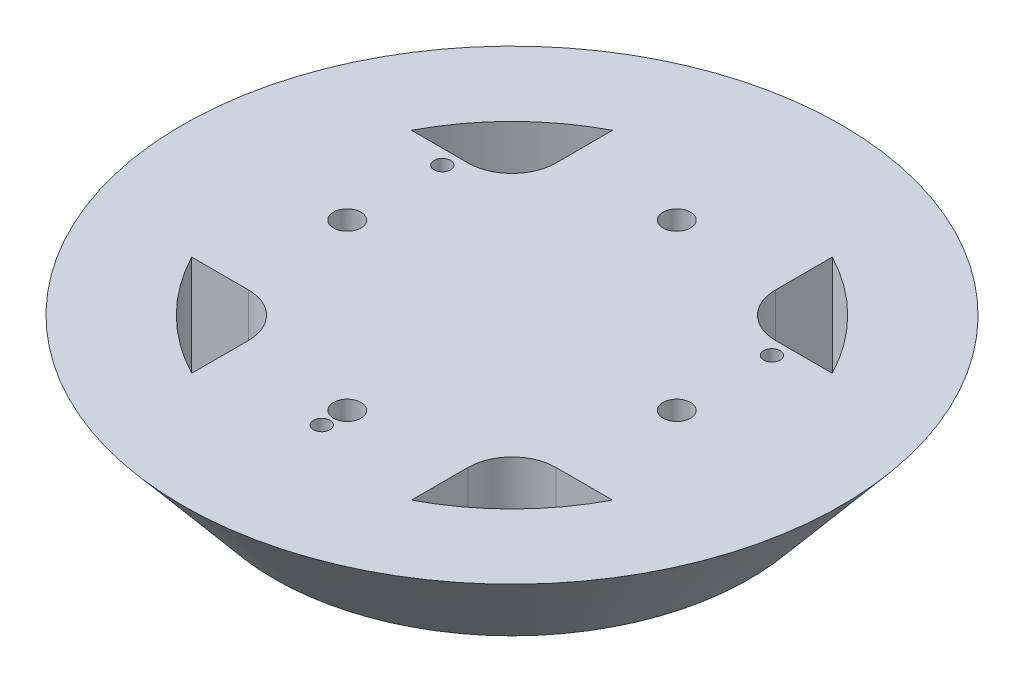
ISO-10303-21;
HEADER;
FILE_DESCRIPTION(('STEP AP214'),'2;1');
FILE_NAME('part.step','',(''),(''),'','','');
FILE_SCHEMA(('AUTOMOTIVE_DESIGN { 1 0 10303 214 1 1 1 1 }'));
ENDSEC;
DATA;
#1=APPLICATION_CONTEXT('core data for automotive mechanical design processes');
#2=APPLICATION_PROTOCOL_DEFINITION('international standard','automotive_design',2000,#1);
#3=PRODUCT_CONTEXT('',#1,'mechanical');
#4=PRODUCT('Part','Part','',(#3));
#5=PRODUCT_RELATED_PRODUCT_CATEGORY('part','',(#4));
#6=PRODUCT_DEFINITION_FORMATION('','',#4);
#7=PRODUCT_DEFINITION_CONTEXT('part definition',#1,'design');
#8=PRODUCT_DEFINITION('design','',#6,#7);
#9=PRODUCT_DEFINITION_SHAPE('','',#8);
#10=(LENGTH_UNIT() NAMED_UNIT(*) SI_UNIT(.MILLI.,.METRE.));
#11=(NAMED_UNIT(*) PLANE_ANGLE_UNIT() SI_UNIT($,.RADIAN.));
#12=(NAMED_UNIT(*) SI_UNIT($,.STERADIAN.) SOLID_ANGLE_UNIT());
#13=UNCERTAINTY_MEASURE_WITH_UNIT(LENGTH_MEASURE(1.E-05),#10,'distance_accuracy_value','');
#14=(GEOMETRIC_REPRESENTATION_CONTEXT(3) GLOBAL_UNCERTAINTY_ASSIGNED_CONTEXT((#13)) GLOBAL_UNIT_ASSIGNED_CONTEXT((#10,
#11,#12)) REPRESENTATION_CONTEXT('',''));
#15=CARTESIAN_POINT('',(0.,0.,0.));
#16=DIRECTION('',(0.,0.,1.));
#17=DIRECTION('',(1.,0.,0.));
#18=AXIS2_PLACEMENT_3D('',#15,#16,#17);
#19=CARTESIAN_POINT('',(0.,-20.,0.));
#20=DIRECTION('',(0.,1.,0.));
#21=DIRECTION('',(0.,0.,1.));
#22=AXIS2_PLACEMENT_3D('',#19,#20,#21);
#23=PLANE('',#22);
#24=CARTESIAN_POINT('',(29.9991199870944,-20.,-17.3199999999992));
#25=DIRECTION('',(0.,-1.,0.));
#26=DIRECTION('',(0.,0.,-1.));
#27=AXIS2_PLACEMENT_3D('',#24,#25,#26);
#28=CIRCLE('',#27,1.49999999999999);
#29=CARTESIAN_POINT('',(29.9991199870944,-20.,-18.8199999999992));
#30=VERTEX_POINT('',#29);
#31=EDGE_CURVE('E491',#30,#30,#28,.T.);
#32=ORIENTED_EDGE('',*,*,#31,.F.);
#33=EDGE_LOOP('',(#32));
#34=FACE_BOUND('',#33,.T.);
#35=CARTESIAN_POINT('',(-29.9991199870915,-20.,-17.3200000000008));
#36=DIRECTION('',(0.,-1.,0.));
#37=DIRECTION('',(0.,0.,-1.));
#38=AXIS2_PLACEMENT_3D('',#35,#36,#37);
#39=CIRCLE('',#38,1.49999999999999);
#40=CARTESIAN_POINT('',(-29.9991199870915,-20.,-18.8200000000008));
#41=VERTEX_POINT('',#40);
#42=EDGE_CURVE('E306',#41,#41,#39,.T.);
#43=ORIENTED_EDGE('',*,*,#42,.F.);
#44=EDGE_LOOP('',(#43));
#45=FACE_BOUND('',#44,.T.);
#46=DIRECTION('',(1.,0.,0.));
#47=VECTOR('',#46,1.);
#48=CARTESIAN_POINT('',(0.,-20.,-20.));
#49=LINE('',#48,#47);
#50=CARTESIAN_POINT('',(-38.3118279594078,-20.,-20.));
#51=VERTEX_POINT('',#50);
#52=CARTESIAN_POINT('',(-28.,-20.,-20.));
#53=VERTEX_POINT('',#52);
#54=EDGE_CURVE('E275',#51,#53,#49,.T.);
#55=ORIENTED_EDGE('',*,*,#54,.T.);
#56=CARTESIAN_POINT('',(-28.,-20.,-28.));
#57=DIRECTION('',(0.,1.,0.));
#58=DIRECTION('',(0.,0.,1.));
#59=AXIS2_PLACEMENT_3D('',#56,#57,#58);
#60=CIRCLE('',#59,8.);
#61=CARTESIAN_POINT('',(-20.,-20.,-28.));
#62=VERTEX_POINT('',#61);
#63=EDGE_CURVE('E251',#53,#62,#60,.T.);
#64=ORIENTED_EDGE('',*,*,#63,.T.);
#65=DIRECTION('',(0.,0.,1.));
#66=VECTOR('',#65,1.);
#67=CARTESIAN_POINT('',(-20.,-20.,0.));
#68=LINE('',#67,#66);
#69=CARTESIAN_POINT('',(-20.,-20.,-38.3118279594078));
#70=VERTEX_POINT('',#69);
#71=EDGE_CURVE('E272',#70,#62,#68,.T.);
#72=ORIENTED_EDGE('',*,*,#71,.F.);
#73=CARTESIAN_POINT('',(0.,-20.,0.));
#74=DIRECTION('',(0.,1.,0.));
#75=DIRECTION('',(0.,0.,1.));
#76=AXIS2_PLACEMENT_3D('',#73,#74,#75);
#77=CIRCLE('',#76,43.2180073764544);
#78=CARTESIAN_POINT('',(20.,-20.,-38.3118279594078));
#79=VERTEX_POINT('',#78);
#80=EDGE_CURVE('E194',#79,#70,#77,.T.);
#81=ORIENTED_EDGE('',*,*,#80,.F.);
#82=DIRECTION('',(0.,0.,1.));
#83=VECTOR('',#82,1.);
#84=CARTESIAN_POINT('',(20.,-20.,0.));
#85=LINE('',#84,#83);
#86=CARTESIAN_POINT('',(20.,-20.,-28.));
#87=VERTEX_POINT('',#86);
#88=EDGE_CURVE('E165',#79,#87,#85,.T.);
#89=ORIENTED_EDGE('',*,*,#88,.T.);
#90=CARTESIAN_POINT('',(28.,-20.,-28.));
#91=DIRECTION('',(0.,1.,0.));
#92=DIRECTION('',(0.,0.,1.));
#93=AXIS2_PLACEMENT_3D('',#90,#91,#92);
#94=CIRCLE('',#93,8.);
#95=CARTESIAN_POINT('',(28.,-20.,-20.));
#96=VERTEX_POINT('',#95);
#97=EDGE_CURVE('E247',#87,#96,#94,.T.);
#98=ORIENTED_EDGE('',*,*,#97,.T.);
#99=DIRECTION('',(-1.,0.,0.));
#100=VECTOR('',#99,1.);
#101=CARTESIAN_POINT('',(0.,-20.,-20.));
#102=LINE('',#101,#100);
#103=CARTESIAN_POINT('',(38.3118279594078,-20.,-20.));
#104=VERTEX_POINT('',#103);
#105=EDGE_CURVE('E320',#104,#96,#102,.T.);
#106=ORIENTED_EDGE('',*,*,#105,.F.);
#107=CARTESIAN_POINT('',(38.3118279594078,-20.,20.));
#108=VERTEX_POINT('',#107);
#109=EDGE_CURVE('E177',#108,#104,#77,.T.);
#110=ORIENTED_EDGE('',*,*,#109,.F.);
#111=DIRECTION('',(-1.,0.,0.));
#112=VECTOR('',#111,1.);
#113=CARTESIAN_POINT('',(0.,-20.,20.));
#114=LINE('',#113,#112);
#115=CARTESIAN_POINT('',(28.,-20.,20.));
#116=VERTEX_POINT('',#115);
#117=EDGE_CURVE('E186',#108,#116,#114,.T.);
#118=ORIENTED_EDGE('',*,*,#117,.T.);
#119=CARTESIAN_POINT('',(28.,-20.,28.));
#120=DIRECTION('',(0.,1.,0.));
#121=DIRECTION('',(0.,0.,1.));
#122=AXIS2_PLACEMENT_3D('',#119,#120,#121);
#123=CIRCLE('',#122,8.);
#124=CARTESIAN_POINT('',(20.,-20.,28.));
#125=VERTEX_POINT('',#124);
#126=EDGE_CURVE('E185',#116,#125,#123,.T.);
#127=ORIENTED_EDGE('',*,*,#126,.T.);
#128=DIRECTION('',(0.,0.,-1.));
#129=VECTOR('',#128,1.);
#130=CARTESIAN_POINT('',(20.,-20.,0.));
#131=LINE('',#130,#129);
#132=CARTESIAN_POINT('',(20.,-20.,38.3118279594078));
#133=VERTEX_POINT('',#132);
#134=EDGE_CURVE('E157',#133,#125,#131,.T.);
#135=ORIENTED_EDGE('',*,*,#134,.F.);
#136=CARTESIAN_POINT('',(-20.,-20.,38.3118279594078));
#137=VERTEX_POINT('',#136);
#138=EDGE_CURVE('E179',#137,#133,#77,.T.);
#139=ORIENTED_EDGE('',*,*,#138,.F.);
#140=DIRECTION('',(0.,0.,-1.));
#141=VECTOR('',#140,1.);
#142=CARTESIAN_POINT('',(-20.,-20.,0.));
#143=LINE('',#142,#141);
#144=CARTESIAN_POINT('',(-20.,-20.,28.));
#145=VERTEX_POINT('',#144);
#146=EDGE_CURVE('E292',#137,#145,#143,.T.);
#147=ORIENTED_EDGE('',*,*,#146,.T.);
#148=CARTESIAN_POINT('',(-28.,-20.,28.));
#149=DIRECTION('',(0.,1.,0.));
#150=DIRECTION('',(0.,0.,1.));
#151=AXIS2_PLACEMENT_3D('',#148,#149,#150);
#152=CIRCLE('',#151,8.);
#153=CARTESIAN_POINT('',(-28.,-20.,20.));
#154=VERTEX_POINT('',#153);
#155=EDGE_CURVE('E49',#145,#154,#152,.T.);
#156=ORIENTED_EDGE('',*,*,#155,.T.);
#157=DIRECTION('',(1.,0.,0.));
#158=VECTOR('',#157,1.);
#159=CARTESIAN_POINT('',(0.,-20.,20.));
#160=LINE('',#159,#158);
#161=CARTESIAN_POINT('',(-38.3118279594078,-20.,20.));
#162=VERTEX_POINT('',#161);
#163=EDGE_CURVE('E290',#162,#154,#160,.T.);
#164=ORIENTED_EDGE('',*,*,#163,.F.);
#165=EDGE_CURVE('E192',#51,#162,#77,.T.);
#166=ORIENTED_EDGE('',*,*,#165,.F.);
#167=EDGE_LOOP('',(#55,#64,#72,#81,#89,#98,#106,#110,#118,#127,#135,#139,#147,#156,#164,#166));
#168=FACE_BOUND('',#167,.T.);
#169=CARTESIAN_POINT('',(0.,-20.,34.64));
#170=DIRECTION('',(0.,-1.,0.));
#171=DIRECTION('',(0.,0.,-1.));
#172=AXIS2_PLACEMENT_3D('',#169,#170,#171);
#173=CIRCLE('',#172,1.49999999999999);
#174=CARTESIAN_POINT('',(0.,-20.,33.14));
#175=VERTEX_POINT('',#174);
#176=EDGE_CURVE('E462',#175,#175,#173,.T.);
#177=ORIENTED_EDGE('',*,*,#176,.F.);
#178=EDGE_LOOP('',(#177));
#179=FACE_BOUND('',#178,.T.);
#180=ADVANCED_FACE('F41',(#34,#45,#168,#179),#23,.F.);
#181=CARTESIAN_POINT('',(0.,0.,0.));
#182=DIRECTION('',(0.,1.,0.));
#183=DIRECTION('',(0.,0.,1.));
#184=AXIS2_PLACEMENT_3D('',#181,#182,#183);
#185=PLANE('',#184);
#186=CARTESIAN_POINT('',(0.,0.,-30.));
#187=DIRECTION('',(0.,1.,0.));
#188=DIRECTION('',(0.,0.,1.));
#189=AXIS2_PLACEMENT_3D('',#186,#187,#188);
#190=CIRCLE('',#189,2.5);
#191=CARTESIAN_POINT('',(0.,0.,-27.5));
#192=VERTEX_POINT('',#191);
#193=EDGE_CURVE('E463',#192,#192,#190,.T.);
#194=ORIENTED_EDGE('',*,*,#193,.F.);
#195=EDGE_LOOP('',(#194));
#196=FACE_BOUND('',#195,.T.);
#197=CARTESIAN_POINT('',(30.0000000000008,0.,-8.48279779752659E-13));
#198=DIRECTION('',(0.,1.,0.));
#199=DIRECTION('',(0.,0.,1.));
#200=AXIS2_PLACEMENT_3D('',#197,#198,#199);
#201=CIRCLE('',#200,2.5);
#202=CARTESIAN_POINT('',(30.0000000000008,0.,2.49999999999915));
#203=VERTEX_POINT('',#202);
#204=EDGE_CURVE('E469',#203,#203,#201,.T.);
#205=ORIENTED_EDGE('',*,*,#204,.F.);
#206=EDGE_LOOP('',(#205));
#207=FACE_BOUND('',#206,.T.);
#208=CARTESIAN_POINT('',(0.,0.,30.));
#209=DIRECTION('',(0.,1.,0.));
#210=DIRECTION('',(0.,0.,1.));
#211=AXIS2_PLACEMENT_3D('',#208,#209,#210);
#212=CIRCLE('',#211,2.5);
#213=CARTESIAN_POINT('',(0.,0.,32.5));
#214=VERTEX_POINT('',#213);
#215=EDGE_CURVE('E477',#214,#214,#212,.T.);
#216=ORIENTED_EDGE('',*,*,#215,.F.);
#217=EDGE_LOOP('',(#216));
#218=FACE_BOUND('',#217,.T.);
#219=CARTESIAN_POINT('',(-29.9999999999991,0.,8.50014503228635E-13));
#220=DIRECTION('',(0.,1.,0.));
#221=DIRECTION('',(0.,0.,1.));
#222=AXIS2_PLACEMENT_3D('',#219,#220,#221);
#223=CIRCLE('',#222,2.5);
#224=CARTESIAN_POINT('',(-29.9999999999991,0.,2.50000000000085));
#225=VERTEX_POINT('',#224);
#226=EDGE_CURVE('E483',#225,#225,#223,.T.);
#227=ORIENTED_EDGE('',*,*,#226,.F.);
#228=EDGE_LOOP('',(#227));
#229=FACE_BOUND('',#228,.T.);
#230=CARTESIAN_POINT('',(0.,0.,34.64));
#231=DIRECTION('',(0.,1.,0.));
#232=DIRECTION('',(0.,0.,1.));
#233=AXIS2_PLACEMENT_3D('',#230,#231,#232);
#234=CIRCLE('',#233,1.49999999999999);
#235=CARTESIAN_POINT('',(0.,0.,36.14));
#236=VERTEX_POINT('',#235);
#237=EDGE_CURVE('E466',#236,#236,#234,.T.);
#238=ORIENTED_EDGE('',*,*,#237,.F.);
#239=EDGE_LOOP('',(#238));
#240=FACE_BOUND('',#239,.T.);
#241=CARTESIAN_POINT('',(29.9991199870944,0.,-17.3199999999992));
#242=DIRECTION('',(0.,1.,0.));
#243=DIRECTION('',(0.,0.,1.));
#244=AXIS2_PLACEMENT_3D('',#241,#242,#243);
#245=CIRCLE('',#244,1.49999999999999);
#246=CARTESIAN_POINT('',(29.9991199870944,0.,-15.8199999999992));
#247=VERTEX_POINT('',#246);
#248=EDGE_CURVE('E311',#247,#247,#245,.T.);
#249=ORIENTED_EDGE('',*,*,#248,.F.);
#250=EDGE_LOOP('',(#249));
#251=FACE_BOUND('',#250,.T.);
#252=CARTESIAN_POINT('',(-29.9991199870915,0.,-17.3200000000008));
#253=DIRECTION('',(0.,1.,0.));
#254=DIRECTION('',(0.,0.,1.));
#255=AXIS2_PLACEMENT_3D('',#252,#253,#254);
#256=CIRCLE('',#255,1.49999999999999);
#257=CARTESIAN_POINT('',(-29.9991199870915,0.,-15.8200000000008));
#258=VERTEX_POINT('',#257);
#259=EDGE_CURVE('E304',#258,#258,#256,.T.);
#260=ORIENTED_EDGE('',*,*,#259,.F.);
#261=EDGE_LOOP('',(#260));
#262=FACE_BOUND('',#261,.T.);
#263=CARTESIAN_POINT('',(0.,0.,0.));
#264=DIRECTION('',(0.,1.,0.));
#265=DIRECTION('',(0.,0.,1.));
#266=AXIS2_PLACEMENT_3D('',#263,#264,#265);
#267=CIRCLE('',#266,43.2180073764544);
#268=CARTESIAN_POINT('',(-38.3118279594078,0.,20.));
#269=VERTEX_POINT('',#268);
#270=CARTESIAN_POINT('',(-20.,0.,38.3118279594078));
#271=VERTEX_POINT('',#270);
#272=EDGE_CURVE('E203',#269,#271,#267,.T.);
#273=ORIENTED_EDGE('',*,*,#272,.F.);
#274=DIRECTION('',(-1.,0.,0.));
#275=VECTOR('',#274,1.);
#276=CARTESIAN_POINT('',(0.,0.,20.));
#277=LINE('',#276,#275);
#278=CARTESIAN_POINT('',(-28.,0.,20.));
#279=VERTEX_POINT('',#278);
#280=EDGE_CURVE('E176',#279,#269,#277,.T.);
#281=ORIENTED_EDGE('',*,*,#280,.F.);
#282=CARTESIAN_POINT('',(-28.,0.,28.));
#283=DIRECTION('',(0.,1.,0.));
#284=DIRECTION('',(0.,0.,1.));
#285=AXIS2_PLACEMENT_3D('',#282,#283,#284);
#286=CIRCLE('',#285,8.);
#287=CARTESIAN_POINT('',(-20.,0.,28.));
#288=VERTEX_POINT('',#287);
#289=EDGE_CURVE('E12',#279,#288,#286,.F.);
#290=ORIENTED_EDGE('',*,*,#289,.T.);
#291=DIRECTION('',(0.,0.,1.));
#292=VECTOR('',#291,1.);
#293=CARTESIAN_POINT('',(-20.,0.,0.));
#294=LINE('',#293,#292);
#295=EDGE_CURVE('E201',#288,#271,#294,.T.);
#296=ORIENTED_EDGE('',*,*,#295,.T.);
#297=EDGE_LOOP('',(#273,#281,#290,#296));
#298=FACE_BOUND('',#297,.T.);
#299=CARTESIAN_POINT('',(0.,0.,0.));
#300=DIRECTION('',(0.,1.,0.));
#301=DIRECTION('',(0.,0.,1.));
#302=AXIS2_PLACEMENT_3D('',#299,#300,#301);
#303=CIRCLE('',#302,60.);
#304=CARTESIAN_POINT('',(0.,0.,60.));
#305=VERTEX_POINT('',#304);
#306=EDGE_CURVE('E193',#305,#305,#303,.T.);
#307=ORIENTED_EDGE('',*,*,#306,.T.);
#308=EDGE_LOOP('',(#307));
#309=FACE_BOUND('',#308,.T.);
#310=DIRECTION('',(0.,0.,1.));
#311=VECTOR('',#310,1.);
#312=CARTESIAN_POINT('',(20.,0.,0.));
#313=LINE('',#312,#311);
#314=CARTESIAN_POINT('',(20.,0.,28.));
#315=VERTEX_POINT('',#314);
#316=CARTESIAN_POINT('',(20.,0.,38.3118279594078));
#317=VERTEX_POINT('',#316);
#318=EDGE_CURVE('E160',#315,#317,#313,.T.);
#319=ORIENTED_EDGE('',*,*,#318,.F.);
#320=CARTESIAN_POINT('',(28.,0.,28.));
#321=DIRECTION('',(0.,1.,0.));
#322=DIRECTION('',(0.,0.,1.));
#323=AXIS2_PLACEMENT_3D('',#320,#321,#322);
#324=CIRCLE('',#323,8.);
#325=CARTESIAN_POINT('',(28.,0.,20.));
#326=VERTEX_POINT('',#325);
#327=EDGE_CURVE('E245',#315,#326,#324,.F.);
#328=ORIENTED_EDGE('',*,*,#327,.T.);
#329=DIRECTION('',(1.,0.,0.));
#330=VECTOR('',#329,1.);
#331=CARTESIAN_POINT('',(0.,0.,20.));
#332=LINE('',#331,#330);
#333=CARTESIAN_POINT('',(38.3118279594078,0.,20.));
#334=VERTEX_POINT('',#333);
#335=EDGE_CURVE('E209',#326,#334,#332,.T.);
#336=ORIENTED_EDGE('',*,*,#335,.T.);
#337=CARTESIAN_POINT('',(0.,0.,0.));
#338=DIRECTION('',(0.,1.,0.));
#339=DIRECTION('',(0.,0.,1.));
#340=AXIS2_PLACEMENT_3D('',#337,#338,#339);
#341=CIRCLE('',#340,43.2180073764544);
#342=EDGE_CURVE('E206',#317,#334,#341,.T.);
#343=ORIENTED_EDGE('',*,*,#342,.F.);
#344=EDGE_LOOP('',(#319,#328,#336,#343));
#345=FACE_BOUND('',#344,.T.);
#346=DIRECTION('',(1.,0.,0.));
#347=VECTOR('',#346,1.);
#348=CARTESIAN_POINT('',(0.,0.,-20.));
#349=LINE('',#348,#347);
#350=CARTESIAN_POINT('',(28.,0.,-20.));
#351=VERTEX_POINT('',#350);
#352=CARTESIAN_POINT('',(38.3118279594078,0.,-20.));
#353=VERTEX_POINT('',#352);
#354=EDGE_CURVE('E214',#351,#353,#349,.T.);
#355=ORIENTED_EDGE('',*,*,#354,.F.);
#356=CARTESIAN_POINT('',(28.,0.,-28.));
#357=DIRECTION('',(0.,1.,0.));
#358=DIRECTION('',(0.,0.,1.));
#359=AXIS2_PLACEMENT_3D('',#356,#357,#358);
#360=CIRCLE('',#359,8.);
#361=CARTESIAN_POINT('',(20.,0.,-28.));
#362=VERTEX_POINT('',#361);
#363=EDGE_CURVE('E249',#351,#362,#360,.F.);
#364=ORIENTED_EDGE('',*,*,#363,.T.);
#365=DIRECTION('',(0.,0.,-1.));
#366=VECTOR('',#365,1.);
#367=CARTESIAN_POINT('',(20.,0.,0.));
#368=LINE('',#367,#366);
#369=CARTESIAN_POINT('',(20.,0.,-38.3118279594078));
#370=VERTEX_POINT('',#369);
#371=EDGE_CURVE('E216',#362,#370,#368,.T.);
#372=ORIENTED_EDGE('',*,*,#371,.T.);
#373=CARTESIAN_POINT('',(0.,0.,0.));
#374=DIRECTION('',(0.,1.,0.));
#375=DIRECTION('',(0.,0.,1.));
#376=AXIS2_PLACEMENT_3D('',#373,#374,#375);
#377=CIRCLE('',#376,43.2180073764544);
#378=EDGE_CURVE('E211',#353,#370,#377,.T.);
#379=ORIENTED_EDGE('',*,*,#378,.F.);
#380=EDGE_LOOP('',(#355,#364,#372,#379));
#381=FACE_BOUND('',#380,.T.);
#382=DIRECTION('',(0.,0.,-1.));
#383=VECTOR('',#382,1.);
#384=CARTESIAN_POINT('',(-20.,0.,0.));
#385=LINE('',#384,#383);
#386=CARTESIAN_POINT('',(-20.,0.,-28.));
#387=VERTEX_POINT('',#386);
#388=CARTESIAN_POINT('',(-20.,0.,-38.3118279594078));
#389=VERTEX_POINT('',#388);
#390=EDGE_CURVE('E221',#387,#389,#385,.T.);
#391=ORIENTED_EDGE('',*,*,#390,.F.);
#392=CARTESIAN_POINT('',(-28.,0.,-28.));
#393=DIRECTION('',(0.,1.,0.));
#394=DIRECTION('',(0.,0.,1.));
#395=AXIS2_PLACEMENT_3D('',#392,#393,#394);
#396=CIRCLE('',#395,8.);
#397=CARTESIAN_POINT('',(-28.,0.,-20.));
#398=VERTEX_POINT('',#397);
#399=EDGE_CURVE('E253',#387,#398,#396,.F.);
#400=ORIENTED_EDGE('',*,*,#399,.T.);
#401=DIRECTION('',(-1.,0.,0.));
#402=VECTOR('',#401,1.);
#403=CARTESIAN_POINT('',(0.,0.,-20.));
#404=LINE('',#403,#402);
#405=CARTESIAN_POINT('',(-38.3118279594078,0.,-20.));
#406=VERTEX_POINT('',#405);
#407=EDGE_CURVE('E223',#398,#406,#404,.T.);
#408=ORIENTED_EDGE('',*,*,#407,.T.);
#409=CARTESIAN_POINT('',(0.,0.,0.));
#410=DIRECTION('',(0.,1.,0.));
#411=DIRECTION('',(0.,0.,1.));
#412=AXIS2_PLACEMENT_3D('',#409,#410,#411);
#413=CIRCLE('',#412,43.2180073764544);
#414=EDGE_CURVE('E218',#389,#406,#413,.T.);
#415=ORIENTED_EDGE('',*,*,#414,.F.);
#416=EDGE_LOOP('',(#391,#400,#408,#415));
#417=FACE_BOUND('',#416,.T.);
#418=ADVANCED_FACE('F258',(#196,#207,#218,#229,#240,#251,#262,#298,#309,#345,#381,#417),#185,.T.);
#419=CARTESIAN_POINT('',(0.,0.,0.));
#420=DIRECTION('',(0.,1.,0.));
#421=DIRECTION('',(0.,0.,1.));
#422=AXIS2_PLACEMENT_3D('',#419,#420,#421);
#423=CONICAL_SURFACE('',#422,60.,0.698131700797733);
#424=EDGE_CURVE('E169',#133,#108,#77,.T.);
#425=ORIENTED_EDGE('',*,*,#424,.T.);
#426=ORIENTED_EDGE('',*,*,#109,.T.);
#427=CARTESIAN_POINT('',(0.,-20.,0.));
#428=DIRECTION('',(0.,-1.,0.));
#429=DIRECTION('',(0.,0.,-1.));
#430=AXIS2_PLACEMENT_3D('',#427,#428,#429);
#431=CIRCLE('',#430,43.2180073764544);
#432=EDGE_CURVE('E324',#79,#104,#431,.T.);
#433=ORIENTED_EDGE('',*,*,#432,.F.);
#434=ORIENTED_EDGE('',*,*,#80,.T.);
#435=CARTESIAN_POINT('',(0.,-20.,0.));
#436=DIRECTION('',(0.,-1.,0.));
#437=DIRECTION('',(0.,0.,-1.));
#438=AXIS2_PLACEMENT_3D('',#435,#436,#437);
#439=CIRCLE('',#438,43.2180073764544);
#440=EDGE_CURVE('E281',#51,#70,#439,.T.);
#441=ORIENTED_EDGE('',*,*,#440,.F.);
#442=ORIENTED_EDGE('',*,*,#165,.T.);
#443=CARTESIAN_POINT('',(0.,-20.,0.));
#444=DIRECTION('',(0.,-1.,0.));
#445=DIRECTION('',(0.,0.,-1.));
#446=AXIS2_PLACEMENT_3D('',#443,#444,#445);
#447=CIRCLE('',#446,43.2180073764544);
#448=EDGE_CURVE('E191',#137,#162,#447,.T.);
#449=ORIENTED_EDGE('',*,*,#448,.F.);
#450=ORIENTED_EDGE('',*,*,#138,.T.);
#451=EDGE_LOOP('',(#425,#426,#433,#434,#441,#442,#449,#450));
#452=FACE_BOUND('',#451,.T.);
#453=ORIENTED_EDGE('',*,*,#306,.F.);
#454=EDGE_LOOP('',(#453));
#455=FACE_BOUND('',#454,.T.);
#456=ADVANCED_FACE('F188',(#452,#455),#423,.T.);
#457=CARTESIAN_POINT('',(0.,5.,0.));
#458=DIRECTION('',(0.,-1.,0.));
#459=DIRECTION('',(0.,0.,-1.));
#460=AXIS2_PLACEMENT_3D('',#457,#458,#459);
#461=CYLINDRICAL_SURFACE('',#460,43.2180073764544);
#462=ORIENTED_EDGE('',*,*,#272,.T.);
#463=DIRECTION('',(0.,-1.,0.));
#464=VECTOR('',#463,1.);
#465=CARTESIAN_POINT('',(-20.,5.,38.3118279594078));
#466=LINE('',#465,#464);
#467=EDGE_CURVE('E196',#271,#137,#466,.T.);
#468=ORIENTED_EDGE('',*,*,#467,.T.);
#469=ORIENTED_EDGE('',*,*,#448,.T.);
#470=DIRECTION('',(0.,-1.,0.));
#471=VECTOR('',#470,1.);
#472=CARTESIAN_POINT('',(-38.3118279594078,5.,20.));
#473=LINE('',#472,#471);
#474=EDGE_CURVE('E294',#269,#162,#473,.T.);
#475=ORIENTED_EDGE('',*,*,#474,.F.);
#476=EDGE_LOOP('',(#462,#468,#469,#475));
#477=FACE_BOUND('',#476,.T.);
#478=ADVANCED_FACE('F361',(#477),#461,.F.);
#479=CARTESIAN_POINT('',(-20.,5.,0.));
#480=DIRECTION('',(-1.,0.,0.));
#481=DIRECTION('',(0.,0.,1.));
#482=AXIS2_PLACEMENT_3D('',#479,#480,#481);
#483=PLANE('',#482);
#484=ORIENTED_EDGE('',*,*,#295,.F.);
#485=DIRECTION('',(0.,-1.,0.));
#486=VECTOR('',#485,1.);
#487=CARTESIAN_POINT('',(-20.,5.,28.));
#488=LINE('',#487,#486);
#489=EDGE_CURVE('E240',#288,#145,#488,.T.);
#490=ORIENTED_EDGE('',*,*,#489,.T.);
#491=ORIENTED_EDGE('',*,*,#146,.F.);
#492=ORIENTED_EDGE('',*,*,#467,.F.);
#493=EDGE_LOOP('',(#484,#490,#491,#492));
#494=FACE_BOUND('',#493,.T.);
#495=ADVANCED_FACE('F392',(#494),#483,.T.);
#496=CARTESIAN_POINT('',(0.,5.,20.));
#497=DIRECTION('',(0.,0.,-1.));
#498=DIRECTION('',(-1.,0.,0.));
#499=AXIS2_PLACEMENT_3D('',#496,#497,#498);
#500=PLANE('',#499);
#501=ORIENTED_EDGE('',*,*,#163,.T.);
#502=DIRECTION('',(0.,-1.,0.));
#503=VECTOR('',#502,1.);
#504=CARTESIAN_POINT('',(-28.,5.,20.));
#505=LINE('',#504,#503);
#506=EDGE_CURVE('E62',#154,#279,#505,.F.);
#507=ORIENTED_EDGE('',*,*,#506,.T.);
#508=ORIENTED_EDGE('',*,*,#280,.T.);
#509=ORIENTED_EDGE('',*,*,#474,.T.);
#510=EDGE_LOOP('',(#501,#507,#508,#509));
#511=FACE_BOUND('',#510,.T.);
#512=ADVANCED_FACE('F297',(#511),#500,.F.);
#513=CARTESIAN_POINT('',(0.,5.,20.));
#514=DIRECTION('',(0.,0.,1.));
#515=DIRECTION('',(1.,0.,0.));
#516=AXIS2_PLACEMENT_3D('',#513,#514,#515);
#517=PLANE('',#516);
#518=ORIENTED_EDGE('',*,*,#335,.F.);
#519=DIRECTION('',(0.,-1.,0.));
#520=VECTOR('',#519,1.);
#521=CARTESIAN_POINT('',(28.,5.,20.));
#522=LINE('',#521,#520);
#523=EDGE_CURVE('E225',#326,#116,#522,.T.);
#524=ORIENTED_EDGE('',*,*,#523,.T.);
#525=ORIENTED_EDGE('',*,*,#117,.F.);
#526=DIRECTION('',(0.,-1.,0.));
#527=VECTOR('',#526,1.);
#528=CARTESIAN_POINT('',(38.3118279594078,5.,20.));
#529=LINE('',#528,#527);
#530=EDGE_CURVE('E164',#334,#108,#529,.T.);
#531=ORIENTED_EDGE('',*,*,#530,.F.);
#532=EDGE_LOOP('',(#518,#524,#525,#531));
#533=FACE_BOUND('',#532,.T.);
#534=ADVANCED_FACE('F348',(#533),#517,.T.);
#535=CARTESIAN_POINT('',(20.,5.,0.));
#536=DIRECTION('',(-1.,0.,0.));
#537=DIRECTION('',(0.,0.,1.));
#538=AXIS2_PLACEMENT_3D('',#535,#536,#537);
#539=PLANE('',#538);
#540=ORIENTED_EDGE('',*,*,#134,.T.);
#541=DIRECTION('',(0.,-1.,0.));
#542=VECTOR('',#541,1.);
#543=CARTESIAN_POINT('',(20.,5.,28.));
#544=LINE('',#543,#542);
#545=EDGE_CURVE('E228',#125,#315,#544,.F.);
#546=ORIENTED_EDGE('',*,*,#545,.T.);
#547=ORIENTED_EDGE('',*,*,#318,.T.);
#548=DIRECTION('',(0.,-1.,0.));
#549=VECTOR('',#548,1.);
#550=CARTESIAN_POINT('',(20.,5.,38.3118279594078));
#551=LINE('',#550,#549);
#552=EDGE_CURVE('E153',#317,#133,#551,.T.);
#553=ORIENTED_EDGE('',*,*,#552,.T.);
#554=EDGE_LOOP('',(#540,#546,#547,#553));
#555=FACE_BOUND('',#554,.T.);
#556=ADVANCED_FACE('F155',(#555),#539,.F.);
#557=CARTESIAN_POINT('',(0.,5.,0.));
#558=DIRECTION('',(0.,-1.,0.));
#559=DIRECTION('',(0.,0.,-1.));
#560=AXIS2_PLACEMENT_3D('',#557,#558,#559);
#561=CYLINDRICAL_SURFACE('',#560,43.2180073764544);
#562=ORIENTED_EDGE('',*,*,#342,.T.);
#563=ORIENTED_EDGE('',*,*,#530,.T.);
#564=ORIENTED_EDGE('',*,*,#424,.F.);
#565=ORIENTED_EDGE('',*,*,#552,.F.);
#566=EDGE_LOOP('',(#562,#563,#564,#565));
#567=FACE_BOUND('',#566,.T.);
#568=ADVANCED_FACE('F170',(#567),#561,.F.);
#569=CARTESIAN_POINT('',(20.,5.,0.));
#570=DIRECTION('',(1.,0.,0.));
#571=DIRECTION('',(0.,0.,-1.));
#572=AXIS2_PLACEMENT_3D('',#569,#570,#571);
#573=PLANE('',#572);
#574=ORIENTED_EDGE('',*,*,#371,.F.);
#575=DIRECTION('',(0.,-1.,0.));
#576=VECTOR('',#575,1.);
#577=CARTESIAN_POINT('',(20.,5.,-28.));
#578=LINE('',#577,#576);
#579=EDGE_CURVE('E230',#362,#87,#578,.T.);
#580=ORIENTED_EDGE('',*,*,#579,.T.);
#581=ORIENTED_EDGE('',*,*,#88,.F.);
#582=DIRECTION('',(0.,-1.,0.));
#583=VECTOR('',#582,1.);
#584=CARTESIAN_POINT('',(20.,5.,-38.3118279594078));
#585=LINE('',#584,#583);
#586=EDGE_CURVE('E317',#370,#79,#585,.T.);
#587=ORIENTED_EDGE('',*,*,#586,.F.);
#588=EDGE_LOOP('',(#574,#580,#581,#587));
#589=FACE_BOUND('',#588,.T.);
#590=ADVANCED_FACE('F332',(#589),#573,.T.);
#591=CARTESIAN_POINT('',(0.,5.,-20.));
#592=DIRECTION('',(0.,0.,1.));
#593=DIRECTION('',(1.,0.,0.));
#594=AXIS2_PLACEMENT_3D('',#591,#592,#593);
#595=PLANE('',#594);
#596=ORIENTED_EDGE('',*,*,#105,.T.);
#597=DIRECTION('',(0.,-1.,0.));
#598=VECTOR('',#597,1.);
#599=CARTESIAN_POINT('',(28.,5.,-20.));
#600=LINE('',#599,#598);
#601=EDGE_CURVE('E233',#96,#351,#600,.F.);
#602=ORIENTED_EDGE('',*,*,#601,.T.);
#603=ORIENTED_EDGE('',*,*,#354,.T.);
#604=DIRECTION('',(0.,-1.,0.));
#605=VECTOR('',#604,1.);
#606=CARTESIAN_POINT('',(38.3118279594078,5.,-20.));
#607=LINE('',#606,#605);
#608=EDGE_CURVE('E288',#353,#104,#607,.T.);
#609=ORIENTED_EDGE('',*,*,#608,.T.);
#610=EDGE_LOOP('',(#596,#602,#603,#609));
#611=FACE_BOUND('',#610,.T.);
#612=ADVANCED_FACE('F345',(#611),#595,.F.);
#613=CARTESIAN_POINT('',(0.,5.,0.));
#614=DIRECTION('',(0.,-1.,0.));
#615=DIRECTION('',(0.,0.,-1.));
#616=AXIS2_PLACEMENT_3D('',#613,#614,#615);
#617=CYLINDRICAL_SURFACE('',#616,43.2180073764544);
#618=ORIENTED_EDGE('',*,*,#378,.T.);
#619=ORIENTED_EDGE('',*,*,#586,.T.);
#620=ORIENTED_EDGE('',*,*,#432,.T.);
#621=ORIENTED_EDGE('',*,*,#608,.F.);
#622=EDGE_LOOP('',(#618,#619,#620,#621));
#623=FACE_BOUND('',#622,.T.);
#624=ADVANCED_FACE('F335',(#623),#617,.F.);
#625=CARTESIAN_POINT('',(0.,5.,-20.));
#626=DIRECTION('',(0.,0.,-1.));
#627=DIRECTION('',(-1.,0.,0.));
#628=AXIS2_PLACEMENT_3D('',#625,#626,#627);
#629=PLANE('',#628);
#630=ORIENTED_EDGE('',*,*,#407,.F.);
#631=DIRECTION('',(0.,-1.,0.));
#632=VECTOR('',#631,1.);
#633=CARTESIAN_POINT('',(-28.,5.,-20.));
#634=LINE('',#633,#632);
#635=EDGE_CURVE('E235',#398,#53,#634,.T.);
#636=ORIENTED_EDGE('',*,*,#635,.T.);
#637=ORIENTED_EDGE('',*,*,#54,.F.);
#638=DIRECTION('',(0.,-1.,0.));
#639=VECTOR('',#638,1.);
#640=CARTESIAN_POINT('',(-38.3118279594078,5.,-20.));
#641=LINE('',#640,#639);
#642=EDGE_CURVE('E267',#406,#51,#641,.T.);
#643=ORIENTED_EDGE('',*,*,#642,.F.);
#644=EDGE_LOOP('',(#630,#636,#637,#643));
#645=FACE_BOUND('',#644,.T.);
#646=ADVANCED_FACE('F265',(#645),#629,.T.);
#647=CARTESIAN_POINT('',(-20.,5.,0.));
#648=DIRECTION('',(1.,0.,0.));
#649=DIRECTION('',(0.,0.,-1.));
#650=AXIS2_PLACEMENT_3D('',#647,#648,#649);
#651=PLANE('',#650);
#652=ORIENTED_EDGE('',*,*,#71,.T.);
#653=DIRECTION('',(0.,-1.,0.));
#654=VECTOR('',#653,1.);
#655=CARTESIAN_POINT('',(-20.,5.,-28.));
#656=LINE('',#655,#654);
#657=EDGE_CURVE('E238',#62,#387,#656,.F.);
#658=ORIENTED_EDGE('',*,*,#657,.T.);
#659=ORIENTED_EDGE('',*,*,#390,.T.);
#660=DIRECTION('',(0.,-1.,0.));
#661=VECTOR('',#660,1.);
#662=CARTESIAN_POINT('',(-20.,5.,-38.3118279594078));
#663=LINE('',#662,#661);
#664=EDGE_CURVE('E279',#389,#70,#663,.T.);
#665=ORIENTED_EDGE('',*,*,#664,.T.);
#666=EDGE_LOOP('',(#652,#658,#659,#665));
#667=FACE_BOUND('',#666,.T.);
#668=ADVANCED_FACE('F277',(#667),#651,.F.);
#669=CARTESIAN_POINT('',(0.,5.,0.));
#670=DIRECTION('',(0.,-1.,0.));
#671=DIRECTION('',(0.,0.,-1.));
#672=AXIS2_PLACEMENT_3D('',#669,#670,#671);
#673=CYLINDRICAL_SURFACE('',#672,43.2180073764544);
#674=ORIENTED_EDGE('',*,*,#414,.T.);
#675=ORIENTED_EDGE('',*,*,#642,.T.);
#676=ORIENTED_EDGE('',*,*,#440,.T.);
#677=ORIENTED_EDGE('',*,*,#664,.F.);
#678=EDGE_LOOP('',(#674,#675,#676,#677));
#679=FACE_BOUND('',#678,.T.);
#680=ADVANCED_FACE('F303',(#679),#673,.F.);
#681=CARTESIAN_POINT('',(-29.9991199870915,-20.,-17.3200000000008));
#682=DIRECTION('',(0.,-1.,0.));
#683=DIRECTION('',(0.,0.,-1.));
#684=AXIS2_PLACEMENT_3D('',#681,#682,#683);
#685=CYLINDRICAL_SURFACE('',#684,1.49999999999999);
#686=ORIENTED_EDGE('',*,*,#42,.T.);
#687=EDGE_LOOP('',(#686));
#688=FACE_BOUND('',#687,.T.);
#689=ORIENTED_EDGE('',*,*,#259,.T.);
#690=EDGE_LOOP('',(#689));
#691=FACE_BOUND('',#690,.T.);
#692=ADVANCED_FACE('F406',(#688,#691),#685,.F.);
#693=CARTESIAN_POINT('',(29.9991199870944,-20.,-17.3199999999992));
#694=DIRECTION('',(0.,-1.,0.));
#695=DIRECTION('',(0.,0.,-1.));
#696=AXIS2_PLACEMENT_3D('',#693,#694,#695);
#697=CYLINDRICAL_SURFACE('',#696,1.49999999999999);
#698=ORIENTED_EDGE('',*,*,#31,.T.);
#699=EDGE_LOOP('',(#698));
#700=FACE_BOUND('',#699,.T.);
#701=ORIENTED_EDGE('',*,*,#248,.T.);
#702=EDGE_LOOP('',(#701));
#703=FACE_BOUND('',#702,.T.);
#704=ADVANCED_FACE('F423',(#700,#703),#697,.F.);
#705=CARTESIAN_POINT('',(0.,-20.,34.64));
#706=DIRECTION('',(0.,-1.,0.));
#707=DIRECTION('',(0.,0.,-1.));
#708=AXIS2_PLACEMENT_3D('',#705,#706,#707);
#709=CYLINDRICAL_SURFACE('',#708,1.49999999999999);
#710=ORIENTED_EDGE('',*,*,#176,.T.);
#711=EDGE_LOOP('',(#710));
#712=FACE_BOUND('',#711,.T.);
#713=ORIENTED_EDGE('',*,*,#237,.T.);
#714=EDGE_LOOP('',(#713));
#715=FACE_BOUND('',#714,.T.);
#716=ADVANCED_FACE('F371',(#712,#715),#709,.F.);
#717=CARTESIAN_POINT('',(28.,5.,28.));
#718=DIRECTION('',(0.,-1.,0.));
#719=DIRECTION('',(0.,0.,-1.));
#720=AXIS2_PLACEMENT_3D('',#717,#718,#719);
#721=CYLINDRICAL_SURFACE('',#720,8.);
#722=ORIENTED_EDGE('',*,*,#327,.F.);
#723=ORIENTED_EDGE('',*,*,#545,.F.);
#724=ORIENTED_EDGE('',*,*,#126,.F.);
#725=ORIENTED_EDGE('',*,*,#523,.F.);
#726=EDGE_LOOP('',(#722,#723,#724,#725));
#727=FACE_BOUND('',#726,.T.);
#728=ADVANCED_FACE('F352',(#727),#721,.F.);
#729=CARTESIAN_POINT('',(28.,5.,-28.));
#730=DIRECTION('',(0.,-1.,0.));
#731=DIRECTION('',(0.,0.,-1.));
#732=AXIS2_PLACEMENT_3D('',#729,#730,#731);
#733=CYLINDRICAL_SURFACE('',#732,8.);
#734=ORIENTED_EDGE('',*,*,#363,.F.);
#735=ORIENTED_EDGE('',*,*,#601,.F.);
#736=ORIENTED_EDGE('',*,*,#97,.F.);
#737=ORIENTED_EDGE('',*,*,#579,.F.);
#738=EDGE_LOOP('',(#734,#735,#736,#737));
#739=FACE_BOUND('',#738,.T.);
#740=ADVANCED_FACE('F342',(#739),#733,.F.);
#741=CARTESIAN_POINT('',(-28.,5.,-28.));
#742=DIRECTION('',(0.,-1.,0.));
#743=DIRECTION('',(0.,0.,-1.));
#744=AXIS2_PLACEMENT_3D('',#741,#742,#743);
#745=CYLINDRICAL_SURFACE('',#744,8.);
#746=ORIENTED_EDGE('',*,*,#399,.F.);
#747=ORIENTED_EDGE('',*,*,#657,.F.);
#748=ORIENTED_EDGE('',*,*,#63,.F.);
#749=ORIENTED_EDGE('',*,*,#635,.F.);
#750=EDGE_LOOP('',(#746,#747,#748,#749));
#751=FACE_BOUND('',#750,.T.);
#752=ADVANCED_FACE('F268',(#751),#745,.F.);
#753=CARTESIAN_POINT('',(-28.,5.,28.));
#754=DIRECTION('',(0.,-1.,0.));
#755=DIRECTION('',(0.,0.,-1.));
#756=AXIS2_PLACEMENT_3D('',#753,#754,#755);
#757=CYLINDRICAL_SURFACE('',#756,8.);
#758=ORIENTED_EDGE('',*,*,#289,.F.);
#759=ORIENTED_EDGE('',*,*,#506,.F.);
#760=ORIENTED_EDGE('',*,*,#155,.F.);
#761=ORIENTED_EDGE('',*,*,#489,.F.);
#762=EDGE_LOOP('',(#758,#759,#760,#761));
#763=FACE_BOUND('',#762,.T.);
#764=ADVANCED_FACE('F43',(#763),#757,.F.);
#765=CARTESIAN_POINT('',(-29.9999999999991,-10.,8.50014503228635E-13));
#766=DIRECTION('',(0.,1.,0.));
#767=DIRECTION('',(0.,0.,1.));
#768=AXIS2_PLACEMENT_3D('',#765,#766,#767);
#769=CYLINDRICAL_SURFACE('',#768,2.5);
#770=CARTESIAN_POINT('',(-29.9999999999991,-10.,8.50014503228635E-13));
#771=DIRECTION('',(0.,1.,0.));
#772=DIRECTION('',(0.,0.,1.));
#773=AXIS2_PLACEMENT_3D('',#770,#771,#772);
#774=CIRCLE('',#773,2.5);
#775=CARTESIAN_POINT('',(-29.9999999999991,-10.,2.50000000000085));
#776=VERTEX_POINT('',#775);
#777=EDGE_CURVE('E486',#776,#776,#774,.T.);
#778=ORIENTED_EDGE('',*,*,#777,.F.);
#779=EDGE_LOOP('',(#778));
#780=FACE_BOUND('',#779,.T.);
#781=ORIENTED_EDGE('',*,*,#226,.T.);
#782=EDGE_LOOP('',(#781));
#783=FACE_BOUND('',#782,.T.);
#784=ADVANCED_FACE('F377',(#780,#783),#769,.F.);
#785=CARTESIAN_POINT('',(0.,-10.,0.));
#786=DIRECTION('',(0.,1.,0.));
#787=DIRECTION('',(0.,0.,1.));
#788=AXIS2_PLACEMENT_3D('',#785,#786,#787);
#789=PLANE('',#788);
#790=ORIENTED_EDGE('',*,*,#777,.T.);
#791=EDGE_LOOP('',(#790));
#792=FACE_BOUND('',#791,.T.);
#793=ADVANCED_FACE('F382',(#792),#789,.T.);
#794=CARTESIAN_POINT('',(0.,-10.,30.));
#795=DIRECTION('',(0.,1.,0.));
#796=DIRECTION('',(0.,0.,1.));
#797=AXIS2_PLACEMENT_3D('',#794,#795,#796);
#798=CYLINDRICAL_SURFACE('',#797,2.5);
#799=CARTESIAN_POINT('',(0.,-10.,30.));
#800=DIRECTION('',(0.,1.,0.));
#801=DIRECTION('',(0.,0.,1.));
#802=AXIS2_PLACEMENT_3D('',#799,#800,#801);
#803=CIRCLE('',#802,2.5);
#804=CARTESIAN_POINT('',(0.,-10.,32.5));
#805=VERTEX_POINT('',#804);
#806=EDGE_CURVE('E480',#805,#805,#803,.T.);
#807=ORIENTED_EDGE('',*,*,#806,.F.);
#808=EDGE_LOOP('',(#807));
#809=FACE_BOUND('',#808,.T.);
#810=ORIENTED_EDGE('',*,*,#215,.T.);
#811=EDGE_LOOP('',(#810));
#812=FACE_BOUND('',#811,.T.);
#813=ADVANCED_FACE('F432',(#809,#812),#798,.F.);
#814=CARTESIAN_POINT('',(0.,-10.,0.));
#815=DIRECTION('',(0.,1.,0.));
#816=DIRECTION('',(0.,0.,1.));
#817=AXIS2_PLACEMENT_3D('',#814,#815,#816);
#818=PLANE('',#817);
#819=ORIENTED_EDGE('',*,*,#806,.T.);
#820=EDGE_LOOP('',(#819));
#821=FACE_BOUND('',#820,.T.);
#822=ADVANCED_FACE('F435',(#821),#818,.T.);
#823=CARTESIAN_POINT('',(30.0000000000008,-10.,-8.48279779752659E-13));
#824=DIRECTION('',(0.,1.,0.));
#825=DIRECTION('',(0.,0.,1.));
#826=AXIS2_PLACEMENT_3D('',#823,#824,#825);
#827=CYLINDRICAL_SURFACE('',#826,2.5);
#828=CARTESIAN_POINT('',(30.0000000000008,-10.,-8.48279779752659E-13));
#829=DIRECTION('',(0.,1.,0.));
#830=DIRECTION('',(0.,0.,1.));
#831=AXIS2_PLACEMENT_3D('',#828,#829,#830);
#832=CIRCLE('',#831,2.5);
#833=CARTESIAN_POINT('',(30.0000000000008,-10.,2.49999999999915));
#834=VERTEX_POINT('',#833);
#835=EDGE_CURVE('E474',#834,#834,#832,.T.);
#836=ORIENTED_EDGE('',*,*,#835,.F.);
#837=EDGE_LOOP('',(#836));
#838=FACE_BOUND('',#837,.T.);
#839=ORIENTED_EDGE('',*,*,#204,.T.);
#840=EDGE_LOOP('',(#839));
#841=FACE_BOUND('',#840,.T.);
#842=ADVANCED_FACE('F438',(#838,#841),#827,.F.);
#843=CARTESIAN_POINT('',(0.,-10.,0.));
#844=DIRECTION('',(0.,1.,0.));
#845=DIRECTION('',(0.,0.,1.));
#846=AXIS2_PLACEMENT_3D('',#843,#844,#845);
#847=PLANE('',#846);
#848=ORIENTED_EDGE('',*,*,#835,.T.);
#849=EDGE_LOOP('',(#848));
#850=FACE_BOUND('',#849,.T.);
#851=ADVANCED_FACE('F443',(#850),#847,.T.);
#852=CARTESIAN_POINT('',(0.,-10.,-30.));
#853=DIRECTION('',(0.,1.,0.));
#854=DIRECTION('',(0.,0.,1.));
#855=AXIS2_PLACEMENT_3D('',#852,#853,#854);
#856=CYLINDRICAL_SURFACE('',#855,2.5);
#857=CARTESIAN_POINT('',(0.,-10.,-30.));
#858=DIRECTION('',(0.,1.,0.));
#859=DIRECTION('',(0.,0.,1.));
#860=AXIS2_PLACEMENT_3D('',#857,#858,#859);
#861=CIRCLE('',#860,2.5);
#862=CARTESIAN_POINT('',(0.,-10.,-27.5));
#863=VERTEX_POINT('',#862);
#864=EDGE_CURVE('E461',#863,#863,#861,.T.);
#865=ORIENTED_EDGE('',*,*,#864,.F.);
#866=EDGE_LOOP('',(#865));
#867=FACE_BOUND('',#866,.T.);
#868=ORIENTED_EDGE('',*,*,#193,.T.);
#869=EDGE_LOOP('',(#868));
#870=FACE_BOUND('',#869,.T.);
#871=ADVANCED_FACE('F446',(#867,#870),#856,.F.);
#872=CARTESIAN_POINT('',(0.,-10.,0.));
#873=DIRECTION('',(0.,1.,0.));
#874=DIRECTION('',(0.,0.,1.));
#875=AXIS2_PLACEMENT_3D('',#872,#873,#874);
#876=PLANE('',#875);
#877=ORIENTED_EDGE('',*,*,#864,.T.);
#878=EDGE_LOOP('',(#877));
#879=FACE_BOUND('',#878,.T.);
#880=ADVANCED_FACE('F453',(#879),#876,.T.);
#881=CLOSED_SHELL('',(#180,#418,#456,#478,#495,#512,#534,#556,#568,#590,#612,#624,#646,#668,
#680,#692,#704,#716,#728,#740,#752,#764,#784,#793,#813,#822,#842,#851,#871,#880));
#882=MANIFOLD_SOLID_BREP('B2',#881);
#883=ADVANCED_BREP_SHAPE_REPRESENTATION('',(#18,#882),#14);
#884=SHAPE_DEFINITION_REPRESENTATION(#9,#883);
ENDSEC;
END-ISO-10303-21;
